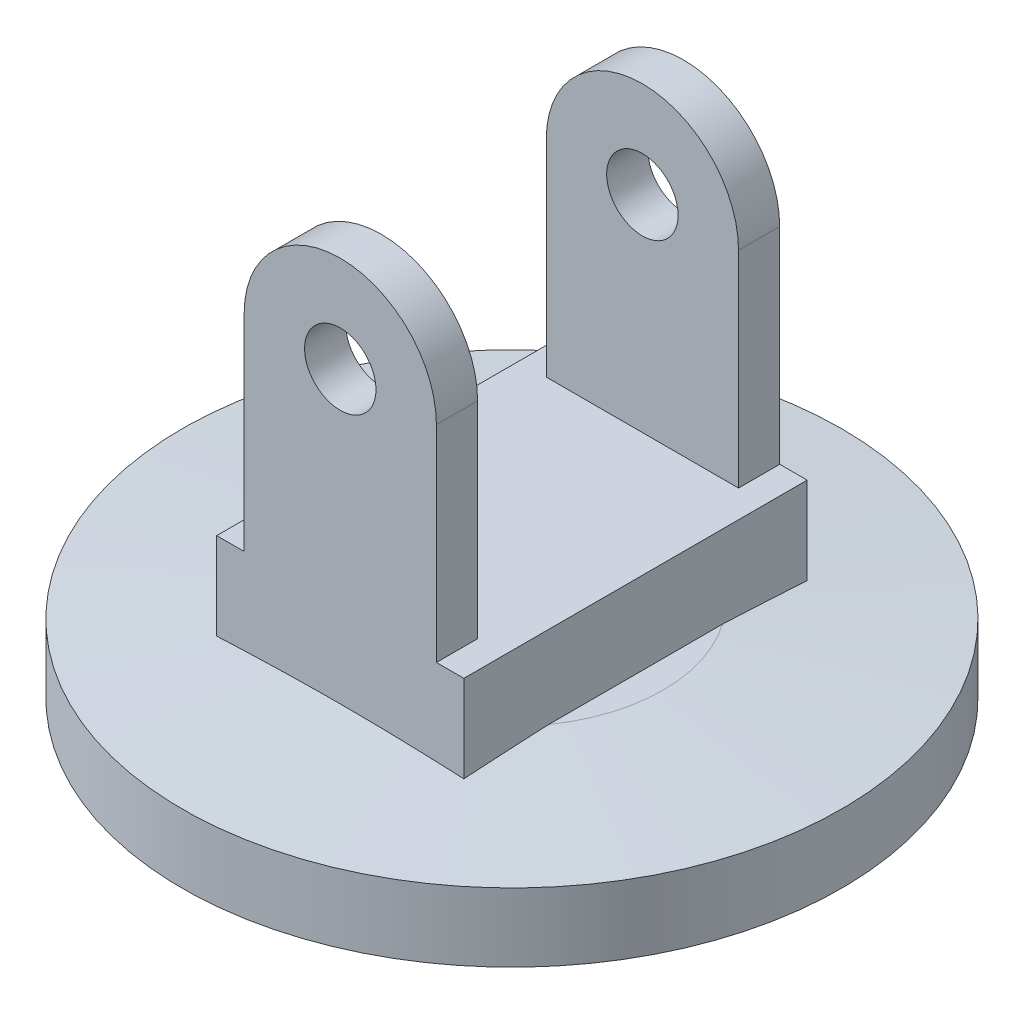
ISO-10303-21;
HEADER;
FILE_DESCRIPTION(('STEP AP214'),'2;1');
FILE_NAME('part.step','',(''),(''),'','','');
FILE_SCHEMA(('AUTOMOTIVE_DESIGN { 1 0 10303 214 1 1 1 1 }'));
ENDSEC;
DATA;
#1=APPLICATION_CONTEXT('core data for automotive mechanical design processes');
#2=APPLICATION_PROTOCOL_DEFINITION('international standard','automotive_design',2000,#1);
#3=PRODUCT_CONTEXT('',#1,'mechanical');
#4=PRODUCT('Part','Part','',(#3));
#5=PRODUCT_RELATED_PRODUCT_CATEGORY('part','',(#4));
#6=PRODUCT_DEFINITION_FORMATION('','',#4);
#7=PRODUCT_DEFINITION_CONTEXT('part definition',#1,'design');
#8=PRODUCT_DEFINITION('design','',#6,#7);
#9=PRODUCT_DEFINITION_SHAPE('','',#8);
#10=(LENGTH_UNIT() NAMED_UNIT(*) SI_UNIT(.MILLI.,.METRE.));
#11=(NAMED_UNIT(*) PLANE_ANGLE_UNIT() SI_UNIT($,.RADIAN.));
#12=(NAMED_UNIT(*) SI_UNIT($,.STERADIAN.) SOLID_ANGLE_UNIT());
#13=UNCERTAINTY_MEASURE_WITH_UNIT(LENGTH_MEASURE(1.E-05),#10,'distance_accuracy_value','');
#14=(GEOMETRIC_REPRESENTATION_CONTEXT(3) GLOBAL_UNCERTAINTY_ASSIGNED_CONTEXT((#13)) GLOBAL_UNIT_ASSIGNED_CONTEXT((#10,
#11,#12)) REPRESENTATION_CONTEXT('',''));
#15=CARTESIAN_POINT('',(0.,0.,0.));
#16=DIRECTION('',(0.,0.,1.));
#17=DIRECTION('',(1.,0.,0.));
#18=AXIS2_PLACEMENT_3D('',#15,#16,#17);
#19=CARTESIAN_POINT('',(9.,-15.,12.5));
#20=DIRECTION('',(0.,-1.,0.));
#21=DIRECTION('',(0.,0.,-1.));
#22=AXIS2_PLACEMENT_3D('',#19,#20,#21);
#23=PLANE('',#22);
#24=DIRECTION('',(0.,0.,1.));
#25=VECTOR('',#24,1.);
#26=CARTESIAN_POINT('',(-7.,-15.,12.5));
#27=LINE('',#26,#25);
#28=CARTESIAN_POINT('',(-7.,-15.,9.5));
#29=VERTEX_POINT('',#28);
#30=CARTESIAN_POINT('',(-7.,-15.,12.5));
#31=VERTEX_POINT('',#30);
#32=EDGE_CURVE('E476',#29,#31,#27,.T.);
#33=ORIENTED_EDGE('',*,*,#32,.F.);
#34=DIRECTION('',(-1.,0.,0.));
#35=VECTOR('',#34,1.);
#36=CARTESIAN_POINT('',(9.,-15.,9.5));
#37=LINE('',#36,#35);
#38=CARTESIAN_POINT('',(7.,-15.,9.5));
#39=VERTEX_POINT('',#38);
#40=EDGE_CURVE('E474',#39,#29,#37,.T.);
#41=ORIENTED_EDGE('',*,*,#40,.F.);
#42=DIRECTION('',(0.,0.,-1.));
#43=VECTOR('',#42,1.);
#44=CARTESIAN_POINT('',(7.,-15.,12.5));
#45=LINE('',#44,#43);
#46=CARTESIAN_POINT('',(7.,-15.,12.5));
#47=VERTEX_POINT('',#46);
#48=EDGE_CURVE('E480',#47,#39,#45,.T.);
#49=ORIENTED_EDGE('',*,*,#48,.F.);
#50=DIRECTION('',(-1.,0.,0.));
#51=VECTOR('',#50,1.);
#52=CARTESIAN_POINT('',(9.,-15.,12.5));
#53=LINE('',#52,#51);
#54=CARTESIAN_POINT('',(9.,-15.,12.5));
#55=VERTEX_POINT('',#54);
#56=EDGE_CURVE('E272',#55,#47,#53,.T.);
#57=ORIENTED_EDGE('',*,*,#56,.F.);
#58=DIRECTION('',(0.,0.,-1.));
#59=VECTOR('',#58,1.);
#60=CARTESIAN_POINT('',(9.,-15.,12.5));
#61=LINE('',#60,#59);
#62=CARTESIAN_POINT('',(9.,-15.,-12.5));
#63=VERTEX_POINT('',#62);
#64=EDGE_CURVE('E271',#55,#63,#61,.T.);
#65=ORIENTED_EDGE('',*,*,#64,.T.);
#66=DIRECTION('',(-1.,0.,0.));
#67=VECTOR('',#66,1.);
#68=CARTESIAN_POINT('',(9.,-15.,-12.5));
#69=LINE('',#68,#67);
#70=CARTESIAN_POINT('',(7.,-15.,-12.5));
#71=VERTEX_POINT('',#70);
#72=EDGE_CURVE('E142',#63,#71,#69,.T.);
#73=ORIENTED_EDGE('',*,*,#72,.T.);
#74=DIRECTION('',(0.,0.,1.));
#75=VECTOR('',#74,1.);
#76=CARTESIAN_POINT('',(7.,-15.,-9.5));
#77=LINE('',#76,#75);
#78=CARTESIAN_POINT('',(7.,-15.,-9.5));
#79=VERTEX_POINT('',#78);
#80=EDGE_CURVE('E235',#71,#79,#77,.T.);
#81=ORIENTED_EDGE('',*,*,#80,.T.);
#82=DIRECTION('',(1.,0.,0.));
#83=VECTOR('',#82,1.);
#84=CARTESIAN_POINT('',(0.,-15.,-9.5));
#85=LINE('',#84,#83);
#86=CARTESIAN_POINT('',(-7.,-15.,-9.5));
#87=VERTEX_POINT('',#86);
#88=EDGE_CURVE('E239',#87,#79,#85,.T.);
#89=ORIENTED_EDGE('',*,*,#88,.F.);
#90=DIRECTION('',(0.,0.,-1.));
#91=VECTOR('',#90,1.);
#92=CARTESIAN_POINT('',(-7.,-15.,-9.5));
#93=LINE('',#92,#91);
#94=CARTESIAN_POINT('',(-7.,-15.,-12.5));
#95=VERTEX_POINT('',#94);
#96=EDGE_CURVE('E228',#87,#95,#93,.T.);
#97=ORIENTED_EDGE('',*,*,#96,.T.);
#98=CARTESIAN_POINT('',(-9.,-15.,-12.5));
#99=VERTEX_POINT('',#98);
#100=EDGE_CURVE('E262',#95,#99,#69,.T.);
#101=ORIENTED_EDGE('',*,*,#100,.T.);
#102=DIRECTION('',(0.,0.,-1.));
#103=VECTOR('',#102,1.);
#104=CARTESIAN_POINT('',(-9.,-15.,12.5));
#105=LINE('',#104,#103);
#106=CARTESIAN_POINT('',(-9.,-15.,12.5));
#107=VERTEX_POINT('',#106);
#108=EDGE_CURVE('E269',#107,#99,#105,.T.);
#109=ORIENTED_EDGE('',*,*,#108,.F.);
#110=EDGE_CURVE('E138',#31,#107,#53,.T.);
#111=ORIENTED_EDGE('',*,*,#110,.F.);
#112=EDGE_LOOP('',(#33,#41,#49,#57,#65,#73,#81,#89,#97,#101,#109,#111));
#113=FACE_BOUND('',#112,.T.);
#114=ADVANCED_FACE('F33',(#113),#23,.F.);
#115=CARTESIAN_POINT('',(-7.,0.,-9.5));
#116=DIRECTION('',(1.,0.,0.));
#117=DIRECTION('',(0.,0.,-1.));
#118=AXIS2_PLACEMENT_3D('',#115,#116,#117);
#119=PLANE('',#118);
#120=ORIENTED_EDGE('',*,*,#96,.F.);
#121=DIRECTION('',(0.,-1.,0.));
#122=VECTOR('',#121,1.);
#123=CARTESIAN_POINT('',(-7.,0.,-9.5));
#124=LINE('',#123,#122);
#125=CARTESIAN_POINT('',(-7.,0.,-9.5));
#126=VERTEX_POINT('',#125);
#127=EDGE_CURVE('E230',#126,#87,#124,.T.);
#128=ORIENTED_EDGE('',*,*,#127,.F.);
#129=DIRECTION('',(0.,0.,-1.));
#130=VECTOR('',#129,1.);
#131=CARTESIAN_POINT('',(-7.,0.,-9.5));
#132=LINE('',#131,#130);
#133=CARTESIAN_POINT('',(-7.,0.,-12.5));
#134=VERTEX_POINT('',#133);
#135=EDGE_CURVE('E155',#126,#134,#132,.T.);
#136=ORIENTED_EDGE('',*,*,#135,.T.);
#137=DIRECTION('',(0.,-1.,0.));
#138=VECTOR('',#137,1.);
#139=CARTESIAN_POINT('',(-7.,0.,-12.5));
#140=LINE('',#139,#138);
#141=EDGE_CURVE('E232',#134,#95,#140,.T.);
#142=ORIENTED_EDGE('',*,*,#141,.T.);
#143=EDGE_LOOP('',(#120,#128,#136,#142));
#144=FACE_BOUND('',#143,.T.);
#145=ADVANCED_FACE('F218',(#144),#119,.F.);
#146=CARTESIAN_POINT('',(7.,0.,-9.5));
#147=DIRECTION('',(-1.,0.,0.));
#148=DIRECTION('',(0.,0.,1.));
#149=AXIS2_PLACEMENT_3D('',#146,#147,#148);
#150=PLANE('',#149);
#151=ORIENTED_EDGE('',*,*,#80,.F.);
#152=DIRECTION('',(0.,1.,0.));
#153=VECTOR('',#152,1.);
#154=CARTESIAN_POINT('',(7.,0.,-12.5));
#155=LINE('',#154,#153);
#156=CARTESIAN_POINT('',(7.,0.,-12.5));
#157=VERTEX_POINT('',#156);
#158=EDGE_CURVE('E247',#71,#157,#155,.T.);
#159=ORIENTED_EDGE('',*,*,#158,.T.);
#160=DIRECTION('',(0.,0.,-1.));
#161=VECTOR('',#160,1.);
#162=CARTESIAN_POINT('',(7.,0.,-9.5));
#163=LINE('',#162,#161);
#164=CARTESIAN_POINT('',(7.,0.,-9.5));
#165=VERTEX_POINT('',#164);
#166=EDGE_CURVE('E158',#165,#157,#163,.T.);
#167=ORIENTED_EDGE('',*,*,#166,.F.);
#168=DIRECTION('',(0.,1.,0.));
#169=VECTOR('',#168,1.);
#170=CARTESIAN_POINT('',(7.,0.,-9.5));
#171=LINE('',#170,#169);
#172=EDGE_CURVE('E244',#79,#165,#171,.T.);
#173=ORIENTED_EDGE('',*,*,#172,.F.);
#174=EDGE_LOOP('',(#151,#159,#167,#173));
#175=FACE_BOUND('',#174,.T.);
#176=ADVANCED_FACE('F211',(#175),#150,.F.);
#177=CARTESIAN_POINT('',(0.,0.,-9.5));
#178=DIRECTION('',(0.,0.,1.));
#179=DIRECTION('',(1.,0.,0.));
#180=AXIS2_PLACEMENT_3D('',#177,#178,#179);
#181=PLANE('',#180);
#182=CARTESIAN_POINT('',(0.,0.,-9.49999999999995));
#183=DIRECTION('',(0.,0.,1.));
#184=DIRECTION('',(1.,0.,0.));
#185=AXIS2_PLACEMENT_3D('',#182,#183,#184);
#186=CIRCLE('',#185,2.6);
#187=CARTESIAN_POINT('',(2.6,0.,-9.49999999999995));
#188=VERTEX_POINT('',#187);
#189=EDGE_CURVE('E293',#188,#188,#186,.T.);
#190=ORIENTED_EDGE('',*,*,#189,.F.);
#191=EDGE_LOOP('',(#190));
#192=FACE_BOUND('',#191,.T.);
#193=ORIENTED_EDGE('',*,*,#127,.T.);
#194=ORIENTED_EDGE('',*,*,#88,.T.);
#195=ORIENTED_EDGE('',*,*,#172,.T.);
#196=CARTESIAN_POINT('',(0.,0.,-9.5));
#197=DIRECTION('',(0.,0.,1.));
#198=DIRECTION('',(1.,0.,0.));
#199=AXIS2_PLACEMENT_3D('',#196,#197,#198);
#200=CIRCLE('',#199,7.);
#201=EDGE_CURVE('E242',#165,#126,#200,.T.);
#202=ORIENTED_EDGE('',*,*,#201,.T.);
#203=EDGE_LOOP('',(#193,#194,#195,#202));
#204=FACE_BOUND('',#203,.T.);
#205=ADVANCED_FACE('F209',(#192,#204),#181,.T.);
#206=CARTESIAN_POINT('',(0.,0.,-9.5));
#207=DIRECTION('',(0.,0.,-1.));
#208=DIRECTION('',(-1.,0.,0.));
#209=AXIS2_PLACEMENT_3D('',#206,#207,#208);
#210=CYLINDRICAL_SURFACE('',#209,7.);
#211=CARTESIAN_POINT('',(0.,0.,-12.5));
#212=DIRECTION('',(0.,0.,1.));
#213=DIRECTION('',(1.,0.,0.));
#214=AXIS2_PLACEMENT_3D('',#211,#212,#213);
#215=CIRCLE('',#214,7.);
#216=EDGE_CURVE('E234',#157,#134,#215,.T.);
#217=ORIENTED_EDGE('',*,*,#216,.T.);
#218=ORIENTED_EDGE('',*,*,#135,.F.);
#219=ORIENTED_EDGE('',*,*,#201,.F.);
#220=ORIENTED_EDGE('',*,*,#166,.T.);
#221=EDGE_LOOP('',(#217,#218,#219,#220));
#222=FACE_BOUND('',#221,.T.);
#223=ADVANCED_FACE('F35',(#222),#210,.T.);
#224=CARTESIAN_POINT('',(0.,0.,-12.5));
#225=DIRECTION('',(0.,0.,1.));
#226=DIRECTION('',(1.,0.,0.));
#227=AXIS2_PLACEMENT_3D('',#224,#225,#226);
#228=PLANE('',#227);
#229=CARTESIAN_POINT('',(0.,0.,-12.5));
#230=DIRECTION('',(0.,0.,1.));
#231=DIRECTION('',(1.,0.,0.));
#232=AXIS2_PLACEMENT_3D('',#229,#230,#231);
#233=CIRCLE('',#232,2.6);
#234=CARTESIAN_POINT('',(2.6,0.,-12.5));
#235=VERTEX_POINT('',#234);
#236=EDGE_CURVE('E296',#235,#235,#233,.T.);
#237=ORIENTED_EDGE('',*,*,#236,.T.);
#238=EDGE_LOOP('',(#237));
#239=FACE_BOUND('',#238,.T.);
#240=DIRECTION('',(0.,1.,0.));
#241=VECTOR('',#240,1.);
#242=CARTESIAN_POINT('',(9.,-23.,-12.5));
#243=LINE('',#242,#241);
#244=CARTESIAN_POINT('',(9.,-21.3386862923653,-12.5));
#245=VERTEX_POINT('',#244);
#246=EDGE_CURVE('E264',#245,#63,#243,.T.);
#247=ORIENTED_EDGE('',*,*,#246,.F.);
#248=CARTESIAN_POINT('',(27.0279563773199,-22.4445017613169,-12.5));
#249=CARTESIAN_POINT('',(26.4073300819667,-22.4011738670259,-12.5));
#250=CARTESIAN_POINT('',(25.7866858992581,-22.3581014376053,-12.5));
#251=CARTESIAN_POINT('',(24.5453539940027,-22.2725817259345,-12.5));
#252=CARTESIAN_POINT('',(23.9246662714221,-22.230134444176,-12.5));
#253=CARTESIAN_POINT('',(22.062525302113,-22.1039015920841,-12.5));
#254=CARTESIAN_POINT('',(20.8209965620428,-22.0212251769324,-12.5));
#255=CARTESIAN_POINT('',(18.3362353773877,-21.8601122835449,-12.5));
#256=CARTESIAN_POINT('',(17.093002607901,-21.7816807612803,-12.5));
#257=CARTESIAN_POINT('',(15.2278418136088,-21.6690370304093,-12.5));
#258=CARTESIAN_POINT('',(14.6060652389096,-21.6323228051513,-12.5));
#259=CARTESIAN_POINT('',(13.362391987279,-21.5609945562132,-12.5));
#260=CARTESIAN_POINT('',(12.7404953104822,-21.5263805301959,-12.5));
#261=CARTESIAN_POINT('',(11.498321806118,-21.4598703553824,-12.5));
#262=CARTESIAN_POINT('',(10.8780453807157,-21.4279667847489,-12.5));
#263=CARTESIAN_POINT('',(9.63733403191042,-21.3674240059342,-12.5));
#264=CARTESIAN_POINT('',(9.01689910820036,-21.3387848041273,-12.5));
#265=CARTESIAN_POINT('',(7.15534217972744,-21.2589366441448,-12.5));
#266=CARTESIAN_POINT('',(5.91393884976821,-21.213795499009,-12.5));
#267=CARTESIAN_POINT('',(4.05170161632457,-21.1636477825377,-12.5));
#268=CARTESIAN_POINT('',(3.43110275538417,-21.1498605754268,-12.5));
#269=CARTESIAN_POINT('',(2.18979126091972,-21.1289162706966,-12.5));
#270=CARTESIAN_POINT('',(1.56907862764879,-21.1217591585018,-12.5));
#271=CARTESIAN_POINT('',(0.327621158797742,-21.1145367002647,-12.5));
#272=CARTESIAN_POINT('',(-0.293123676107438,-21.1144712406477,-12.5));
#273=CARTESIAN_POINT('',(-1.53457199987434,-21.1214303283866,-12.5));
#274=CARTESIAN_POINT('',(-2.15527548872897,-21.1284548769561,-12.5));
#275=CARTESIAN_POINT('',(-3.78650847602796,-21.1556691039234,-12.5));
#276=CARTESIAN_POINT('',(-4.79694719051132,-21.1813572940729,-12.5));
#277=CARTESIAN_POINT('',(-6.81736592557242,-21.2468075925863,-12.5));
#278=CARTESIAN_POINT('',(-7.82734593609403,-21.2865699958723,-12.5));
#279=CARTESIAN_POINT('',(-9.84732079275754,-21.3762675578861,-12.5));
#280=CARTESIAN_POINT('',(-10.8573154212279,-21.4262075056942,-12.5));
#281=CARTESIAN_POINT('',(-12.8769137963955,-21.5331713665044,-12.5));
#282=CARTESIAN_POINT('',(-13.8865175466121,-21.5901952141622,-12.5));
#283=CARTESIAN_POINT('',(-15.9077904410113,-21.7093012723377,-12.5));
#284=CARTESIAN_POINT('',(-16.9194589008042,-21.7713949877419,-12.5));
#285=CARTESIAN_POINT('',(-18.9425775619455,-21.8990639141739,-12.5));
#286=CARTESIAN_POINT('',(-19.9540277626862,-21.964639134775,-12.5));
#287=CARTESIAN_POINT('',(-21.9759660835288,-22.0982266330635,-12.5));
#288=CARTESIAN_POINT('',(-22.9864543337819,-22.1662369499753,-12.5));
#289=CARTESIAN_POINT('',(-25.0072954147916,-22.3041240616276,-12.5));
#290=CARTESIAN_POINT('',(-26.0176482465828,-22.3740008411829,-12.5));
#291=CARTESIAN_POINT('',(-27.0279563773199,-22.4445017613169,-12.5));
#292=B_SPLINE_CURVE_WITH_KNOTS('',3,(#248,#249,#250,#251,#252,#253,#254,#255,#256,#257,#258,
#259,#260,#261,#262,#263,#264,#265,#266,#267,#268,#269,#270,#271,#272,#273,#274,#275,#276,#277,
#278,#279,#280,#281,#282,#283,#284,#285,#286,#287,#288,#289,#290,#291),.UNSPECIFIED.,.F.,.F.,(4,
2,2,2,2,2,2,2,2,2,2,2,2,2,2,2,2,2,2,2,2,4),(0.,1.86641064896309,3.73282276600613,
7.46565394178664,11.2027531855936,13.071329066279,14.9399028674275,16.8031830734495,
18.6664669178917,22.3929469704361,24.2551736062321,26.1173961481212,27.9795888660386,
29.841781902707,32.8739383383289,35.9061583158694,38.939808423611,41.9734305499945,
45.0141390429525,48.0548558975352,51.0931770789347,54.1314735488474),.UNSPECIFIED.);
#293=CARTESIAN_POINT('',(-9.,-21.3386862923653,-12.5));
#294=VERTEX_POINT('',#293);
#295=EDGE_CURVE('E196',#245,#294,#292,.T.);
#296=ORIENTED_EDGE('',*,*,#295,.T.);
#297=DIRECTION('',(0.,-1.,0.));
#298=VECTOR('',#297,1.);
#299=CARTESIAN_POINT('',(-9.,-15.,-12.5));
#300=LINE('',#299,#298);
#301=EDGE_CURVE('E263',#99,#294,#300,.T.);
#302=ORIENTED_EDGE('',*,*,#301,.F.);
#303=ORIENTED_EDGE('',*,*,#100,.F.);
#304=ORIENTED_EDGE('',*,*,#141,.F.);
#305=ORIENTED_EDGE('',*,*,#216,.F.);
#306=ORIENTED_EDGE('',*,*,#158,.F.);
#307=ORIENTED_EDGE('',*,*,#72,.F.);
#308=EDGE_LOOP('',(#247,#296,#302,#303,#304,#305,#306,#307));
#309=FACE_BOUND('',#308,.T.);
#310=ADVANCED_FACE('F207',(#239,#309),#228,.F.);
#311=CARTESIAN_POINT('',(-9.,-15.,12.5));
#312=DIRECTION('',(1.,0.,0.));
#313=DIRECTION('',(0.,0.,-1.));
#314=AXIS2_PLACEMENT_3D('',#311,#312,#313);
#315=PLANE('',#314);
#316=ORIENTED_EDGE('',*,*,#301,.T.);
#317=CARTESIAN_POINT('',(-9.,-22.3805279329002,-27.5121952038362));
#318=CARTESIAN_POINT('',(-9.,-22.3385545699229,-26.9380713404014));
#319=CARTESIAN_POINT('',(-9.,-22.2967048503467,-26.3639384497637));
#320=CARTESIAN_POINT('',(-9.,-22.2133071955917,-25.2156506319127));
#321=CARTESIAN_POINT('',(-9.,-22.1717592604775,-24.6414957046946));
#322=CARTESIAN_POINT('',(-9.,-22.0476486361249,-22.918974650947));
#323=CARTESIAN_POINT('',(-9.,-21.9656204187323,-21.7705698630441));
#324=CARTESIAN_POINT('',(-9.,-21.803547549943,-19.4717206317187));
#325=CARTESIAN_POINT('',(-9.,-21.7235063853216,-18.3212759420946));
#326=CARTESIAN_POINT('',(-9.,-21.5667140750172,-16.0201733074279));
#327=CARTESIAN_POINT('',(-9.,-21.4899628913169,-14.869515365004));
#328=CARTESIAN_POINT('',(-9.,-21.3790772583359,-13.1452841241037));
#329=CARTESIAN_POINT('',(-9.,-21.342882410692,-12.5718436676562));
#330=CARTESIAN_POINT('',(-9.,-21.2722988616028,-11.4248519251983));
#331=CARTESIAN_POINT('',(-9.,-21.2379101574486,-10.8513006393553));
#332=CARTESIAN_POINT('',(-9.,-21.1715165063283,-9.70402845812856));
#333=CARTESIAN_POINT('',(-9.,-21.1395116867402,-9.13030755532373));
#334=CARTESIAN_POINT('',(-9.,-21.0786854354535,-7.98269455458174));
#335=CARTESIAN_POINT('',(-9.,-21.0498640080102,-7.40880245641678));
#336=CARTESIAN_POINT('',(-9.,-20.9964829259121,-6.26136454349097));
#337=CARTESIAN_POINT('',(-9.,-20.9719192414156,-5.68781891896818));
#338=CARTESIAN_POINT('',(-9.,-20.9283200444487,-4.54051395251221));
#339=CARTESIAN_POINT('',(-9.,-20.9092845239188,-3.96675461089184));
#340=CARTESIAN_POINT('',(-9.,-20.8781487725291,-2.8191162788945));
#341=CARTESIAN_POINT('',(-9.,-20.8660476486319,-2.24523731345004));
#342=CARTESIAN_POINT('',(-9.,-20.8499316266541,-1.0973663054187));
#343=CARTESIAN_POINT('',(-9.,-20.8459166646426,-0.523374263761714));
#344=CARTESIAN_POINT('',(-9.,-20.8464120162339,0.622504621317029));
#345=CARTESIAN_POINT('',(-9.,-20.8508911735684,1.19439147893496));
#346=CARTESIAN_POINT('',(-9.,-20.8678272930068,2.33804744731669));
#347=CARTESIAN_POINT('',(-9.,-20.8802843185898,2.90981655710738));
#348=CARTESIAN_POINT('',(-9.,-20.9120115635067,4.05323405548661));
#349=CARTESIAN_POINT('',(-9.,-20.9312826604613,4.6248824190296));
#350=CARTESIAN_POINT('',(-9.,-20.9752467217728,5.76796697215654));
#351=CARTESIAN_POINT('',(-9.,-20.9999396926851,6.33940316148312));
#352=CARTESIAN_POINT('',(-9.,-21.0534970206585,7.48262193512239));
#353=CARTESIAN_POINT('',(-9.,-21.0823653229097,8.05440433195334));
#354=CARTESIAN_POINT('',(-9.,-21.1432255054166,9.19780046312379));
#355=CARTESIAN_POINT('',(-9.,-21.1752173814965,9.76941419768775));
#356=CARTESIAN_POINT('',(-9.,-21.241543112847,10.9124739197086));
#357=CARTESIAN_POINT('',(-9.,-21.275876841593,11.4839199145555));
#358=CARTESIAN_POINT('',(-9.,-21.346320950256,12.6267026928091));
#359=CARTESIAN_POINT('',(-9.,-21.3824313327534,13.198039476056));
#360=CARTESIAN_POINT('',(-9.,-21.4930323211429,14.9159363207377));
#361=CARTESIAN_POINT('',(-9.,-21.5695530772028,16.0623653464095));
#362=CARTESIAN_POINT('',(-9.,-21.7258409956354,18.355001643517));
#363=CARTESIAN_POINT('',(-9.,-21.8056081633212,19.5012089145868));
#364=CARTESIAN_POINT('',(-9.,-21.9267768172963,21.2194768306405));
#365=CARTESIAN_POINT('',(-9.,-21.9673856676841,21.791593507374));
#366=CARTESIAN_POINT('',(-9.,-22.0490356040772,22.9357954102357));
#367=CARTESIAN_POINT('',(-9.,-22.0900766896415,23.5078806363955));
#368=CARTESIAN_POINT('',(-9.,-22.213742738994,25.2240794331588));
#369=CARTESIAN_POINT('',(-9.,-22.2969117513535,26.3681538650245));
#370=CARTESIAN_POINT('',(-9.,-22.3805279329002,27.5121952038362));
#371=B_SPLINE_CURVE_WITH_KNOTS('',3,(#317,#318,#319,#320,#321,#322,#323,#324,#325,#326,#327,
#328,#329,#330,#331,#332,#333,#334,#335,#336,#337,#338,#339,#340,#341,#342,#343,#344,#345,#346,
#347,#348,#349,#350,#351,#352,#353,#354,#355,#356,#357,#358,#359,#360,#361,#362,#363,#364,#365,
#366,#367,#368,#369,#370),.UNSPECIFIED.,.F.,.F.,(4,2,2,2,2,2,2,2,2,2,2,2,2,2,2,2,2,2,2,2,2,2,2,
2,2,2,4),(0.,1.72696832083591,3.4539370109857,6.90792736515722,10.3676023521006,
13.8272373500822,15.5509801158056,17.2747202961833,18.9985525150277,20.7223870380249,
22.444580980723,24.1667724126262,25.8887420044062,27.6106979818854,29.3263500718005,
31.0420158131456,32.7579026048231,34.4737914711434,36.1913123700302,37.9088309728508,
39.6262568557694,41.3436852333065,44.7906158656035,48.2375521393282,49.9582201955596,
51.6788864964429,55.1201657361334),.UNSPECIFIED.);
#372=CARTESIAN_POINT('',(-9.,-21.,-6.32455532033676));
#373=VERTEX_POINT('',#372);
#374=EDGE_CURVE('E49',#294,#373,#371,.T.);
#375=ORIENTED_EDGE('',*,*,#374,.T.);
#376=DIRECTION('',(0.,0.,1.));
#377=VECTOR('',#376,1.);
#378=CARTESIAN_POINT('',(-9.,-21.,12.5));
#379=LINE('',#378,#377);
#380=CARTESIAN_POINT('',(-9.,-21.,6.32455532033676));
#381=VERTEX_POINT('',#380);
#382=EDGE_CURVE('E53',#373,#381,#379,.T.);
#383=ORIENTED_EDGE('',*,*,#382,.T.);
#384=CARTESIAN_POINT('',(-9.,-21.3386862923653,12.5));
#385=VERTEX_POINT('',#384);
#386=EDGE_CURVE('E144',#381,#385,#371,.T.);
#387=ORIENTED_EDGE('',*,*,#386,.T.);
#388=DIRECTION('',(0.,-1.,0.));
#389=VECTOR('',#388,1.);
#390=CARTESIAN_POINT('',(-9.,-15.,12.5));
#391=LINE('',#390,#389);
#392=EDGE_CURVE('E133',#107,#385,#391,.T.);
#393=ORIENTED_EDGE('',*,*,#392,.F.);
#394=ORIENTED_EDGE('',*,*,#108,.T.);
#395=EDGE_LOOP('',(#316,#375,#383,#387,#393,#394));
#396=FACE_BOUND('',#395,.T.);
#397=ADVANCED_FACE('F145',(#396),#315,.F.);
#398=CARTESIAN_POINT('',(9.,-23.,12.5));
#399=DIRECTION('',(-1.,0.,0.));
#400=DIRECTION('',(0.,0.,1.));
#401=AXIS2_PLACEMENT_3D('',#398,#399,#400);
#402=PLANE('',#401);
#403=DIRECTION('',(0.,1.,0.));
#404=VECTOR('',#403,1.);
#405=CARTESIAN_POINT('',(9.,-23.,12.5));
#406=LINE('',#405,#404);
#407=CARTESIAN_POINT('',(9.,-21.3386862923653,12.5));
#408=VERTEX_POINT('',#407);
#409=EDGE_CURVE('E141',#408,#55,#406,.T.);
#410=ORIENTED_EDGE('',*,*,#409,.F.);
#411=CARTESIAN_POINT('',(9.,-22.3805279329002,27.5121952038362));
#412=CARTESIAN_POINT('',(9.,-22.3385545699229,26.9380713404014));
#413=CARTESIAN_POINT('',(9.,-22.2967048503467,26.3639384497637));
#414=CARTESIAN_POINT('',(9.,-22.2133071955917,25.2156506319127));
#415=CARTESIAN_POINT('',(9.,-22.1717592604775,24.6414957046946));
#416=CARTESIAN_POINT('',(9.,-22.0476486361249,22.918974650947));
#417=CARTESIAN_POINT('',(9.,-21.9656204187323,21.7705698630441));
#418=CARTESIAN_POINT('',(9.,-21.803547549943,19.4717206317187));
#419=CARTESIAN_POINT('',(9.,-21.7235063853216,18.3212759420946));
#420=CARTESIAN_POINT('',(9.,-21.5667140750172,16.0201733074279));
#421=CARTESIAN_POINT('',(9.,-21.4899628913169,14.869515365004));
#422=CARTESIAN_POINT('',(9.,-21.3790772583359,13.1452841241037));
#423=CARTESIAN_POINT('',(9.,-21.342882410692,12.5718436676562));
#424=CARTESIAN_POINT('',(9.,-21.2722988616028,11.4248519251983));
#425=CARTESIAN_POINT('',(9.,-21.2379101574486,10.8513006393553));
#426=CARTESIAN_POINT('',(9.,-21.1715165063283,9.70402845812856));
#427=CARTESIAN_POINT('',(9.,-21.1395116867402,9.13030755532373));
#428=CARTESIAN_POINT('',(9.,-21.0786854354535,7.98269455458174));
#429=CARTESIAN_POINT('',(9.,-21.0498640080102,7.40880245641678));
#430=CARTESIAN_POINT('',(9.,-20.9964829259121,6.26136454349097));
#431=CARTESIAN_POINT('',(9.,-20.9719192414156,5.68781891896818));
#432=CARTESIAN_POINT('',(9.,-20.9283200444487,4.54051395251221));
#433=CARTESIAN_POINT('',(9.,-20.9092845239188,3.96675461089184));
#434=CARTESIAN_POINT('',(9.,-20.8781487725291,2.8191162788945));
#435=CARTESIAN_POINT('',(9.,-20.8660476486319,2.24523731345004));
#436=CARTESIAN_POINT('',(9.,-20.8499316266541,1.0973663054187));
#437=CARTESIAN_POINT('',(9.,-20.8459166646426,0.523374263761714));
#438=CARTESIAN_POINT('',(9.,-20.8464120162339,-0.622504621317029));
#439=CARTESIAN_POINT('',(9.,-20.8508911735684,-1.19439147893496));
#440=CARTESIAN_POINT('',(9.,-20.8678272930068,-2.33804744731669));
#441=CARTESIAN_POINT('',(9.,-20.8802843185898,-2.90981655710738));
#442=CARTESIAN_POINT('',(9.,-20.9120115635067,-4.05323405548661));
#443=CARTESIAN_POINT('',(9.,-20.9312826604613,-4.6248824190296));
#444=CARTESIAN_POINT('',(9.,-20.9752467217728,-5.76796697215654));
#445=CARTESIAN_POINT('',(9.,-20.9999396926851,-6.33940316148312));
#446=CARTESIAN_POINT('',(9.,-21.0534970206585,-7.48262193512239));
#447=CARTESIAN_POINT('',(9.,-21.0823653229097,-8.05440433195334));
#448=CARTESIAN_POINT('',(9.,-21.1432255054166,-9.19780046312379));
#449=CARTESIAN_POINT('',(9.,-21.1752173814965,-9.76941419768775));
#450=CARTESIAN_POINT('',(9.,-21.241543112847,-10.9124739197086));
#451=CARTESIAN_POINT('',(9.,-21.275876841593,-11.4839199145555));
#452=CARTESIAN_POINT('',(9.,-21.346320950256,-12.6267026928091));
#453=CARTESIAN_POINT('',(9.,-21.3824313327534,-13.198039476056));
#454=CARTESIAN_POINT('',(9.,-21.4930323211429,-14.9159363207377));
#455=CARTESIAN_POINT('',(9.,-21.5695530772028,-16.0623653464095));
#456=CARTESIAN_POINT('',(9.,-21.7258409956354,-18.355001643517));
#457=CARTESIAN_POINT('',(9.,-21.8056081633212,-19.5012089145868));
#458=CARTESIAN_POINT('',(9.,-21.9267768172963,-21.2194768306405));
#459=CARTESIAN_POINT('',(9.,-21.9673856676841,-21.791593507374));
#460=CARTESIAN_POINT('',(9.,-22.0490356040772,-22.9357954102357));
#461=CARTESIAN_POINT('',(9.,-22.0900766896415,-23.5078806363955));
#462=CARTESIAN_POINT('',(9.,-22.213742738994,-25.2240794331588));
#463=CARTESIAN_POINT('',(9.,-22.2969117513535,-26.3681538650245));
#464=CARTESIAN_POINT('',(9.,-22.3805279329002,-27.5121952038362));
#465=B_SPLINE_CURVE_WITH_KNOTS('',3,(#411,#412,#413,#414,#415,#416,#417,#418,#419,#420,#421,
#422,#423,#424,#425,#426,#427,#428,#429,#430,#431,#432,#433,#434,#435,#436,#437,#438,#439,#440,
#441,#442,#443,#444,#445,#446,#447,#448,#449,#450,#451,#452,#453,#454,#455,#456,#457,#458,#459,
#460,#461,#462,#463,#464),.UNSPECIFIED.,.F.,.F.,(4,2,2,2,2,2,2,2,2,2,2,2,2,2,2,2,2,2,2,2,2,2,2,
2,2,2,4),(0.,1.72696832083591,3.4539370109857,6.90792736515722,10.3676023521006,
13.8272373500822,15.5509801158056,17.2747202961833,18.9985525150277,20.7223870380249,
22.444580980723,24.1667724126262,25.8887420044062,27.6106979818854,29.3263500718005,
31.0420158131456,32.7579026048231,34.4737914711434,36.1913123700302,37.9088309728508,
39.6262568557694,41.3436852333065,44.7906158656035,48.2375521393282,49.9582201955596,
51.6788864964429,55.1201657361334),.UNSPECIFIED.);
#466=CARTESIAN_POINT('',(9.,-21.,6.32455532033676));
#467=VERTEX_POINT('',#466);
#468=EDGE_CURVE('E150',#408,#467,#465,.T.);
#469=ORIENTED_EDGE('',*,*,#468,.T.);
#470=DIRECTION('',(0.,0.,-1.));
#471=VECTOR('',#470,1.);
#472=CARTESIAN_POINT('',(9.,-21.,12.5));
#473=LINE('',#472,#471);
#474=CARTESIAN_POINT('',(9.,-21.,-6.32455532033676));
#475=VERTEX_POINT('',#474);
#476=EDGE_CURVE('E11',#467,#475,#473,.T.);
#477=ORIENTED_EDGE('',*,*,#476,.T.);
#478=EDGE_CURVE('E149',#475,#245,#465,.T.);
#479=ORIENTED_EDGE('',*,*,#478,.T.);
#480=ORIENTED_EDGE('',*,*,#246,.T.);
#481=ORIENTED_EDGE('',*,*,#64,.F.);
#482=EDGE_LOOP('',(#410,#469,#477,#479,#480,#481));
#483=FACE_BOUND('',#482,.T.);
#484=ADVANCED_FACE('F206',(#483),#402,.F.);
#485=CARTESIAN_POINT('',(0.,0.,12.5));
#486=DIRECTION('',(0.,0.,1.));
#487=DIRECTION('',(1.,0.,0.));
#488=AXIS2_PLACEMENT_3D('',#485,#486,#487);
#489=PLANE('',#488);
#490=CARTESIAN_POINT('',(0.,0.,12.5));
#491=DIRECTION('',(0.,0.,1.));
#492=DIRECTION('',(1.,0.,0.));
#493=AXIS2_PLACEMENT_3D('',#490,#491,#492);
#494=CIRCLE('',#493,2.6);
#495=CARTESIAN_POINT('',(2.6,0.,12.5));
#496=VERTEX_POINT('',#495);
#497=EDGE_CURVE('E299',#496,#496,#494,.T.);
#498=ORIENTED_EDGE('',*,*,#497,.F.);
#499=EDGE_LOOP('',(#498));
#500=FACE_BOUND('',#499,.T.);
#501=CARTESIAN_POINT('',(27.0279563773199,-22.4445017613169,12.5));
#502=CARTESIAN_POINT('',(26.4073300819667,-22.4011738670259,12.5));
#503=CARTESIAN_POINT('',(25.7866858992581,-22.3581014376053,12.5));
#504=CARTESIAN_POINT('',(24.5453539940027,-22.2725817259345,12.5));
#505=CARTESIAN_POINT('',(23.9246662714221,-22.230134444176,12.5));
#506=CARTESIAN_POINT('',(22.062525302113,-22.1039015920841,12.5));
#507=CARTESIAN_POINT('',(20.8209965620428,-22.0212251769324,12.5));
#508=CARTESIAN_POINT('',(18.3362353773877,-21.8601122835449,12.5));
#509=CARTESIAN_POINT('',(17.093002607901,-21.7816807612803,12.5));
#510=CARTESIAN_POINT('',(15.2278418136088,-21.6690370304093,12.5));
#511=CARTESIAN_POINT('',(14.6060652389096,-21.6323228051513,12.5));
#512=CARTESIAN_POINT('',(13.362391987279,-21.5609945562132,12.5));
#513=CARTESIAN_POINT('',(12.7404953104822,-21.5263805301959,12.5));
#514=CARTESIAN_POINT('',(11.498321806118,-21.4598703553824,12.5));
#515=CARTESIAN_POINT('',(10.8780453807157,-21.4279667847489,12.5));
#516=CARTESIAN_POINT('',(9.63733403191042,-21.3674240059342,12.5));
#517=CARTESIAN_POINT('',(9.01689910820036,-21.3387848041273,12.5));
#518=CARTESIAN_POINT('',(7.15534217972744,-21.2589366441448,12.5));
#519=CARTESIAN_POINT('',(5.91393884976821,-21.213795499009,12.5));
#520=CARTESIAN_POINT('',(4.05170161632457,-21.1636477825377,12.5));
#521=CARTESIAN_POINT('',(3.43110275538417,-21.1498605754268,12.5));
#522=CARTESIAN_POINT('',(2.18979126091972,-21.1289162706966,12.5));
#523=CARTESIAN_POINT('',(1.56907862764879,-21.1217591585018,12.5));
#524=CARTESIAN_POINT('',(0.327621158797742,-21.1145367002647,12.5));
#525=CARTESIAN_POINT('',(-0.293123676107438,-21.1144712406477,12.5));
#526=CARTESIAN_POINT('',(-1.53457199987434,-21.1214303283866,12.5));
#527=CARTESIAN_POINT('',(-2.15527548872897,-21.1284548769561,12.5));
#528=CARTESIAN_POINT('',(-3.78650847602796,-21.1556691039234,12.5));
#529=CARTESIAN_POINT('',(-4.79694719051132,-21.1813572940729,12.5));
#530=CARTESIAN_POINT('',(-6.81736592557242,-21.2468075925863,12.5));
#531=CARTESIAN_POINT('',(-7.82734593609403,-21.2865699958723,12.5));
#532=CARTESIAN_POINT('',(-9.84732079275754,-21.3762675578861,12.5));
#533=CARTESIAN_POINT('',(-10.8573154212279,-21.4262075056942,12.5));
#534=CARTESIAN_POINT('',(-12.8769137963955,-21.5331713665044,12.5));
#535=CARTESIAN_POINT('',(-13.8865175466121,-21.5901952141622,12.5));
#536=CARTESIAN_POINT('',(-15.9077904410113,-21.7093012723377,12.5));
#537=CARTESIAN_POINT('',(-16.9194589008042,-21.7713949877419,12.5));
#538=CARTESIAN_POINT('',(-18.9425775619455,-21.8990639141739,12.5));
#539=CARTESIAN_POINT('',(-19.9540277626862,-21.964639134775,12.5));
#540=CARTESIAN_POINT('',(-21.9759660835288,-22.0982266330635,12.5));
#541=CARTESIAN_POINT('',(-22.9864543337819,-22.1662369499753,12.5));
#542=CARTESIAN_POINT('',(-25.0072954147916,-22.3041240616276,12.5));
#543=CARTESIAN_POINT('',(-26.0176482465828,-22.3740008411829,12.5));
#544=CARTESIAN_POINT('',(-27.0279563773199,-22.4445017613169,12.5));
#545=B_SPLINE_CURVE_WITH_KNOTS('',3,(#501,#502,#503,#504,#505,#506,#507,#508,#509,#510,#511,
#512,#513,#514,#515,#516,#517,#518,#519,#520,#521,#522,#523,#524,#525,#526,#527,#528,#529,#530,
#531,#532,#533,#534,#535,#536,#537,#538,#539,#540,#541,#542,#543,#544),.UNSPECIFIED.,.F.,.F.,(4,
2,2,2,2,2,2,2,2,2,2,2,2,2,2,2,2,2,2,2,2,4),(0.,1.86641064896309,3.73282276600613,
7.46565394178664,11.2027531855936,13.071329066279,14.9399028674275,16.8031830734495,
18.6664669178917,22.3929469704361,24.2551736062321,26.1173961481212,27.9795888660386,
29.841781902707,32.8739383383289,35.9061583158694,38.939808423611,41.9734305499945,
45.0141390429525,48.0548558975352,51.0931770789347,54.1314735488474),.UNSPECIFIED.);
#546=EDGE_CURVE('E42',#408,#385,#545,.T.);
#547=ORIENTED_EDGE('',*,*,#546,.F.);
#548=ORIENTED_EDGE('',*,*,#409,.T.);
#549=ORIENTED_EDGE('',*,*,#56,.T.);
#550=DIRECTION('',(0.,1.,0.));
#551=VECTOR('',#550,1.);
#552=CARTESIAN_POINT('',(7.,0.,12.5));
#553=LINE('',#552,#551);
#554=CARTESIAN_POINT('',(7.,0.,12.5));
#555=VERTEX_POINT('',#554);
#556=EDGE_CURVE('E491',#47,#555,#553,.T.);
#557=ORIENTED_EDGE('',*,*,#556,.T.);
#558=CARTESIAN_POINT('',(0.,0.,12.5));
#559=DIRECTION('',(0.,0.,1.));
#560=DIRECTION('',(1.,0.,0.));
#561=AXIS2_PLACEMENT_3D('',#558,#559,#560);
#562=CIRCLE('',#561,7.);
#563=CARTESIAN_POINT('',(-7.,0.,12.5));
#564=VERTEX_POINT('',#563);
#565=EDGE_CURVE('E494',#555,#564,#562,.T.);
#566=ORIENTED_EDGE('',*,*,#565,.T.);
#567=DIRECTION('',(0.,-1.,0.));
#568=VECTOR('',#567,1.);
#569=CARTESIAN_POINT('',(-7.,0.,12.5));
#570=LINE('',#569,#568);
#571=EDGE_CURVE('E501',#564,#31,#570,.T.);
#572=ORIENTED_EDGE('',*,*,#571,.T.);
#573=ORIENTED_EDGE('',*,*,#110,.T.);
#574=ORIENTED_EDGE('',*,*,#392,.T.);
#575=EDGE_LOOP('',(#547,#548,#549,#557,#566,#572,#573,#574));
#576=FACE_BOUND('',#575,.T.);
#577=ADVANCED_FACE('F134',(#500,#576),#489,.T.);
#578=CARTESIAN_POINT('',(0.,0.,9.5));
#579=DIRECTION('',(0.,0.,1.));
#580=DIRECTION('',(1.,0.,0.));
#581=AXIS2_PLACEMENT_3D('',#578,#579,#580);
#582=PLANE('',#581);
#583=CARTESIAN_POINT('',(0.,0.,9.50000000000006));
#584=DIRECTION('',(0.,0.,1.));
#585=DIRECTION('',(1.,0.,0.));
#586=AXIS2_PLACEMENT_3D('',#583,#584,#585);
#587=CIRCLE('',#586,2.6);
#588=CARTESIAN_POINT('',(2.6,0.,9.50000000000006));
#589=VERTEX_POINT('',#588);
#590=EDGE_CURVE('E37',#589,#589,#587,.T.);
#591=ORIENTED_EDGE('',*,*,#590,.T.);
#592=EDGE_LOOP('',(#591));
#593=FACE_BOUND('',#592,.T.);
#594=DIRECTION('',(0.,1.,0.));
#595=VECTOR('',#594,1.);
#596=CARTESIAN_POINT('',(7.,0.,9.5));
#597=LINE('',#596,#595);
#598=CARTESIAN_POINT('',(7.,0.,9.5));
#599=VERTEX_POINT('',#598);
#600=EDGE_CURVE('E492',#39,#599,#597,.T.);
#601=ORIENTED_EDGE('',*,*,#600,.F.);
#602=ORIENTED_EDGE('',*,*,#40,.T.);
#603=DIRECTION('',(0.,-1.,0.));
#604=VECTOR('',#603,1.);
#605=CARTESIAN_POINT('',(-7.,0.,9.5));
#606=LINE('',#605,#604);
#607=CARTESIAN_POINT('',(-7.,0.,9.5));
#608=VERTEX_POINT('',#607);
#609=EDGE_CURVE('E495',#608,#29,#606,.T.);
#610=ORIENTED_EDGE('',*,*,#609,.F.);
#611=CARTESIAN_POINT('',(0.,0.,9.5));
#612=DIRECTION('',(0.,0.,1.));
#613=DIRECTION('',(1.,0.,0.));
#614=AXIS2_PLACEMENT_3D('',#611,#612,#613);
#615=CIRCLE('',#614,7.);
#616=EDGE_CURVE('E497',#599,#608,#615,.T.);
#617=ORIENTED_EDGE('',*,*,#616,.F.);
#618=EDGE_LOOP('',(#601,#602,#610,#617));
#619=FACE_BOUND('',#618,.T.);
#620=ADVANCED_FACE('F306',(#593,#619),#582,.F.);
#621=CARTESIAN_POINT('',(-7.,0.,12.5));
#622=DIRECTION('',(1.,0.,0.));
#623=DIRECTION('',(0.,0.,-1.));
#624=AXIS2_PLACEMENT_3D('',#621,#622,#623);
#625=PLANE('',#624);
#626=ORIENTED_EDGE('',*,*,#609,.T.);
#627=ORIENTED_EDGE('',*,*,#32,.T.);
#628=ORIENTED_EDGE('',*,*,#571,.F.);
#629=DIRECTION('',(0.,0.,-1.));
#630=VECTOR('',#629,1.);
#631=CARTESIAN_POINT('',(-7.,0.,12.5));
#632=LINE('',#631,#630);
#633=EDGE_CURVE('E485',#564,#608,#632,.T.);
#634=ORIENTED_EDGE('',*,*,#633,.T.);
#635=EDGE_LOOP('',(#626,#627,#628,#634));
#636=FACE_BOUND('',#635,.T.);
#637=ADVANCED_FACE('F361',(#636),#625,.F.);
#638=CARTESIAN_POINT('',(7.,0.,12.5));
#639=DIRECTION('',(-1.,0.,0.));
#640=DIRECTION('',(0.,0.,1.));
#641=AXIS2_PLACEMENT_3D('',#638,#639,#640);
#642=PLANE('',#641);
#643=ORIENTED_EDGE('',*,*,#556,.F.);
#644=ORIENTED_EDGE('',*,*,#48,.T.);
#645=ORIENTED_EDGE('',*,*,#600,.T.);
#646=DIRECTION('',(0.,0.,-1.));
#647=VECTOR('',#646,1.);
#648=CARTESIAN_POINT('',(7.,0.,12.5));
#649=LINE('',#648,#647);
#650=EDGE_CURVE('E488',#555,#599,#649,.T.);
#651=ORIENTED_EDGE('',*,*,#650,.F.);
#652=EDGE_LOOP('',(#643,#644,#645,#651));
#653=FACE_BOUND('',#652,.T.);
#654=ADVANCED_FACE('F353',(#653),#642,.F.);
#655=CARTESIAN_POINT('',(0.,0.,12.5));
#656=DIRECTION('',(0.,0.,-1.));
#657=DIRECTION('',(-1.,0.,0.));
#658=AXIS2_PLACEMENT_3D('',#655,#656,#657);
#659=CYLINDRICAL_SURFACE('',#658,7.);
#660=ORIENTED_EDGE('',*,*,#616,.T.);
#661=ORIENTED_EDGE('',*,*,#633,.F.);
#662=ORIENTED_EDGE('',*,*,#565,.F.);
#663=ORIENTED_EDGE('',*,*,#650,.T.);
#664=EDGE_LOOP('',(#660,#661,#662,#663));
#665=FACE_BOUND('',#664,.T.);
#666=ADVANCED_FACE('F345',(#665),#659,.T.);
#667=CARTESIAN_POINT('',(0.,-21.,0.));
#668=DIRECTION('',(0.,1.,0.));
#669=DIRECTION('',(0.,0.,1.));
#670=AXIS2_PLACEMENT_3D('',#667,#668,#669);
#671=PLANE('',#670);
#672=ORIENTED_EDGE('',*,*,#382,.F.);
#673=CARTESIAN_POINT('',(0.,-21.,0.));
#674=DIRECTION('',(0.,-1.,0.));
#675=DIRECTION('',(0.,0.,-1.));
#676=AXIS2_PLACEMENT_3D('',#673,#674,#675);
#677=CIRCLE('',#676,11.);
#678=EDGE_CURVE('E285',#381,#373,#677,.T.);
#679=ORIENTED_EDGE('',*,*,#678,.F.);
#680=EDGE_LOOP('',(#672,#679));
#681=FACE_BOUND('',#680,.T.);
#682=ADVANCED_FACE('F178',(#681),#671,.T.);
#683=ORIENTED_EDGE('',*,*,#476,.F.);
#684=EDGE_CURVE('E283',#475,#467,#677,.T.);
#685=ORIENTED_EDGE('',*,*,#684,.F.);
#686=EDGE_LOOP('',(#683,#685));
#687=FACE_BOUND('',#686,.T.);
#688=ADVANCED_FACE('F175',(#687),#671,.T.);
#689=CARTESIAN_POINT('',(0.,-22.,0.));
#690=DIRECTION('',(0.,-1.,0.));
#691=DIRECTION('',(0.,0.,-1.));
#692=AXIS2_PLACEMENT_3D('',#689,#690,#691);
#693=CONICAL_SURFACE('',#692,24.,1.49402443552512);
#694=CARTESIAN_POINT('',(0.,-22.,0.));
#695=DIRECTION('',(0.,-1.,0.));
#696=DIRECTION('',(0.,0.,-1.));
#697=AXIS2_PLACEMENT_3D('',#694,#695,#696);
#698=CIRCLE('',#697,24.);
#699=CARTESIAN_POINT('',(0.,-22.,-24.));
#700=VERTEX_POINT('',#699);
#701=EDGE_CURVE('E286',#700,#700,#698,.T.);
#702=ORIENTED_EDGE('',*,*,#701,.F.);
#703=EDGE_LOOP('',(#702));
#704=FACE_BOUND('',#703,.T.);
#705=ORIENTED_EDGE('',*,*,#374,.F.);
#706=ORIENTED_EDGE('',*,*,#295,.F.);
#707=ORIENTED_EDGE('',*,*,#478,.F.);
#708=ORIENTED_EDGE('',*,*,#684,.T.);
#709=ORIENTED_EDGE('',*,*,#468,.F.);
#710=ORIENTED_EDGE('',*,*,#546,.T.);
#711=ORIENTED_EDGE('',*,*,#386,.F.);
#712=ORIENTED_EDGE('',*,*,#678,.T.);
#713=EDGE_LOOP('',(#705,#706,#707,#708,#709,#710,#711,#712));
#714=FACE_BOUND('',#713,.T.);
#715=ADVANCED_FACE('F153',(#704,#714),#693,.T.);
#716=CARTESIAN_POINT('',(0.,-31.,0.));
#717=DIRECTION('',(0.,-1.,0.));
#718=DIRECTION('',(0.,0.,-1.));
#719=AXIS2_PLACEMENT_3D('',#716,#717,#718);
#720=CYLINDRICAL_SURFACE('',#719,24.);
#721=ORIENTED_EDGE('',*,*,#701,.T.);
#722=EDGE_LOOP('',(#721));
#723=FACE_BOUND('',#722,.T.);
#724=CARTESIAN_POINT('',(0.,-27.,0.));
#725=DIRECTION('',(0.,-1.,0.));
#726=DIRECTION('',(0.,0.,-1.));
#727=AXIS2_PLACEMENT_3D('',#724,#725,#726);
#728=CIRCLE('',#727,24.);
#729=CARTESIAN_POINT('',(0.,-27.,-24.));
#730=VERTEX_POINT('',#729);
#731=EDGE_CURVE('E290',#730,#730,#728,.T.);
#732=ORIENTED_EDGE('',*,*,#731,.F.);
#733=EDGE_LOOP('',(#732));
#734=FACE_BOUND('',#733,.T.);
#735=ADVANCED_FACE('F174',(#723,#734),#720,.T.);
#736=CARTESIAN_POINT('',(11.,-27.,0.));
#737=DIRECTION('',(0.,-1.,0.));
#738=DIRECTION('',(0.,0.,-1.));
#739=AXIS2_PLACEMENT_3D('',#736,#737,#738);
#740=PLANE('',#739);
#741=ORIENTED_EDGE('',*,*,#731,.T.);
#742=EDGE_LOOP('',(#741));
#743=FACE_BOUND('',#742,.T.);
#744=ADVANCED_FACE('F312',(#743),#740,.T.);
#745=CARTESIAN_POINT('',(0.,0.,-1000.));
#746=DIRECTION('',(0.,0.,1.));
#747=DIRECTION('',(1.,0.,0.));
#748=AXIS2_PLACEMENT_3D('',#745,#746,#747);
#749=CYLINDRICAL_SURFACE('',#748,2.6);
#750=ORIENTED_EDGE('',*,*,#497,.T.);
#751=EDGE_LOOP('',(#750));
#752=FACE_BOUND('',#751,.T.);
#753=ORIENTED_EDGE('',*,*,#590,.F.);
#754=EDGE_LOOP('',(#753));
#755=FACE_BOUND('',#754,.T.);
#756=ADVANCED_FACE('F309',(#752,#755),#749,.F.);
#757=ORIENTED_EDGE('',*,*,#189,.T.);
#758=EDGE_LOOP('',(#757));
#759=FACE_BOUND('',#758,.T.);
#760=ORIENTED_EDGE('',*,*,#236,.F.);
#761=EDGE_LOOP('',(#760));
#762=FACE_BOUND('',#761,.T.);
#763=ADVANCED_FACE('F311',(#759,#762),#749,.F.);
#764=CLOSED_SHELL('',(#114,#145,#176,#205,#223,#310,#397,#484,#577,#620,#637,#654,#666,#682,
#688,#715,#735,#744,#756,#763));
#765=MANIFOLD_SOLID_BREP('B2',#764);
#766=ADVANCED_BREP_SHAPE_REPRESENTATION('',(#18,#765),#14);
#767=SHAPE_DEFINITION_REPRESENTATION(#9,#766);
ENDSEC;
END-ISO-10303-21;
